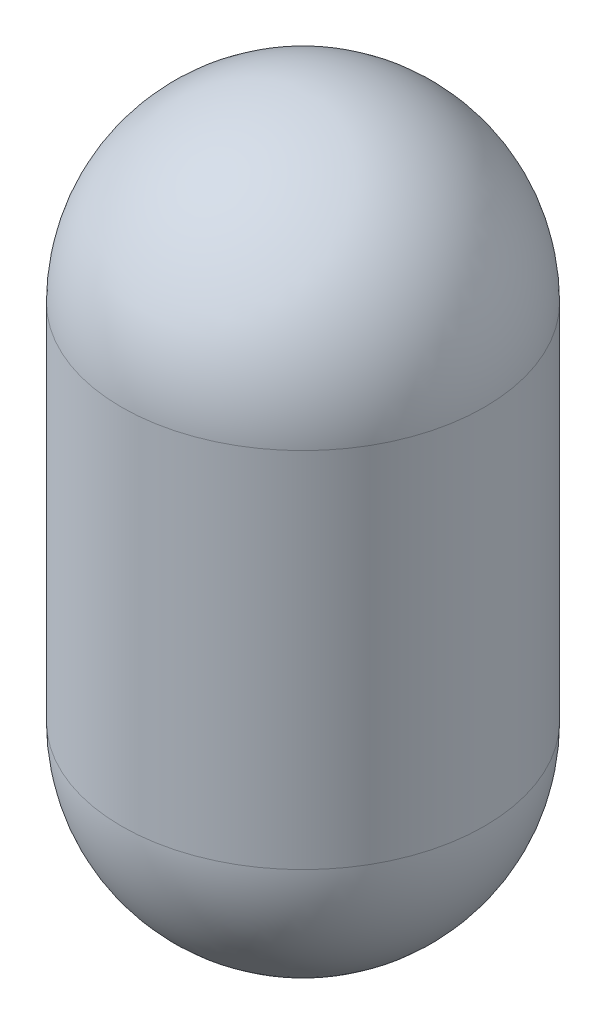
ISO-10303-21;
HEADER;
FILE_DESCRIPTION(('STEP AP214'),'2;1');
FILE_NAME('part.step','',(''),(''),'','','');
FILE_SCHEMA(('AUTOMOTIVE_DESIGN { 1 0 10303 214 1 1 1 1 }'));
ENDSEC;
DATA;
#1=APPLICATION_CONTEXT('core data for automotive mechanical design processes');
#2=APPLICATION_PROTOCOL_DEFINITION('international standard','automotive_design',2000,#1);
#3=PRODUCT_CONTEXT('',#1,'mechanical');
#4=PRODUCT('Part','Part','',(#3));
#5=PRODUCT_RELATED_PRODUCT_CATEGORY('part','',(#4));
#6=PRODUCT_DEFINITION_FORMATION('','',#4);
#7=PRODUCT_DEFINITION_CONTEXT('part definition',#1,'design');
#8=PRODUCT_DEFINITION('design','',#6,#7);
#9=PRODUCT_DEFINITION_SHAPE('','',#8);
#10=(LENGTH_UNIT() NAMED_UNIT(*) SI_UNIT(.MILLI.,.METRE.));
#11=(NAMED_UNIT(*) PLANE_ANGLE_UNIT() SI_UNIT($,.RADIAN.));
#12=(NAMED_UNIT(*) SI_UNIT($,.STERADIAN.) SOLID_ANGLE_UNIT());
#13=UNCERTAINTY_MEASURE_WITH_UNIT(LENGTH_MEASURE(1.E-05),#10,'distance_accuracy_value','');
#14=(GEOMETRIC_REPRESENTATION_CONTEXT(3) GLOBAL_UNCERTAINTY_ASSIGNED_CONTEXT((#13)) GLOBAL_UNIT_ASSIGNED_CONTEXT((#10,
#11,#12)) REPRESENTATION_CONTEXT('',''));
#15=CARTESIAN_POINT('',(0.,0.,0.));
#16=DIRECTION('',(0.,0.,1.));
#17=DIRECTION('',(1.,0.,0.));
#18=AXIS2_PLACEMENT_3D('',#15,#16,#17);
#19=CARTESIAN_POINT('',(0.,38.,0.));
#20=DIRECTION('',(0.,-1.,0.));
#21=DIRECTION('',(0.,0.,-1.));
#22=AXIS2_PLACEMENT_3D('',#19,#20,#21);
#23=CYLINDRICAL_SURFACE('',#22,9.5);
#24=CARTESIAN_POINT('',(0.,9.5,0.));
#25=DIRECTION('',(0.,-1.,0.));
#26=DIRECTION('',(0.,0.,-1.));
#27=AXIS2_PLACEMENT_3D('',#24,#25,#26);
#28=CIRCLE('',#27,9.5);
#29=CARTESIAN_POINT('',(0.,9.5,-9.5));
#30=VERTEX_POINT('',#29);
#31=EDGE_CURVE('E10',#30,#30,#28,.F.);
#32=ORIENTED_EDGE('',*,*,#31,.T.);
#33=EDGE_LOOP('',(#32));
#34=FACE_BOUND('',#33,.T.);
#35=CARTESIAN_POINT('',(0.,28.5,0.));
#36=DIRECTION('',(0.,-1.,0.));
#37=DIRECTION('',(0.,0.,-1.));
#38=AXIS2_PLACEMENT_3D('',#35,#36,#37);
#39=CIRCLE('',#38,9.5);
#40=CARTESIAN_POINT('',(0.,28.5,-9.5));
#41=VERTEX_POINT('',#40);
#42=EDGE_CURVE('E44',#41,#41,#39,.T.);
#43=ORIENTED_EDGE('',*,*,#42,.T.);
#44=EDGE_LOOP('',(#43));
#45=FACE_BOUND('',#44,.T.);
#46=ADVANCED_FACE('F37',(#34,#45),#23,.T.);
#47=CARTESIAN_POINT('',(0.,9.5,0.));
#48=DIRECTION('',(0.,1.,0.));
#49=DIRECTION('',(0.,0.,1.));
#50=AXIS2_PLACEMENT_3D('',#47,#48,#49);
#51=SPHERICAL_SURFACE('',#50,9.5);
#52=ORIENTED_EDGE('',*,*,#31,.F.);
#53=EDGE_LOOP('',(#52));
#54=FACE_BOUND('',#53,.T.);
#55=ADVANCED_FACE('F52',(#54),#51,.T.);
#56=CARTESIAN_POINT('',(0.,28.5,0.));
#57=DIRECTION('',(0.,1.,0.));
#58=DIRECTION('',(0.,0.,1.));
#59=AXIS2_PLACEMENT_3D('',#56,#57,#58);
#60=SPHERICAL_SURFACE('',#59,9.5);
#61=ORIENTED_EDGE('',*,*,#42,.F.);
#62=EDGE_LOOP('',(#61));
#63=FACE_BOUND('',#62,.T.);
#64=ADVANCED_FACE('F39',(#63),#60,.T.);
#65=CLOSED_SHELL('',(#46,#55,#64));
#66=MANIFOLD_SOLID_BREP('B2',#65);
#67=ADVANCED_BREP_SHAPE_REPRESENTATION('',(#18,#66),#14);
#68=SHAPE_DEFINITION_REPRESENTATION(#9,#67);
ENDSEC;
END-ISO-10303-21;
